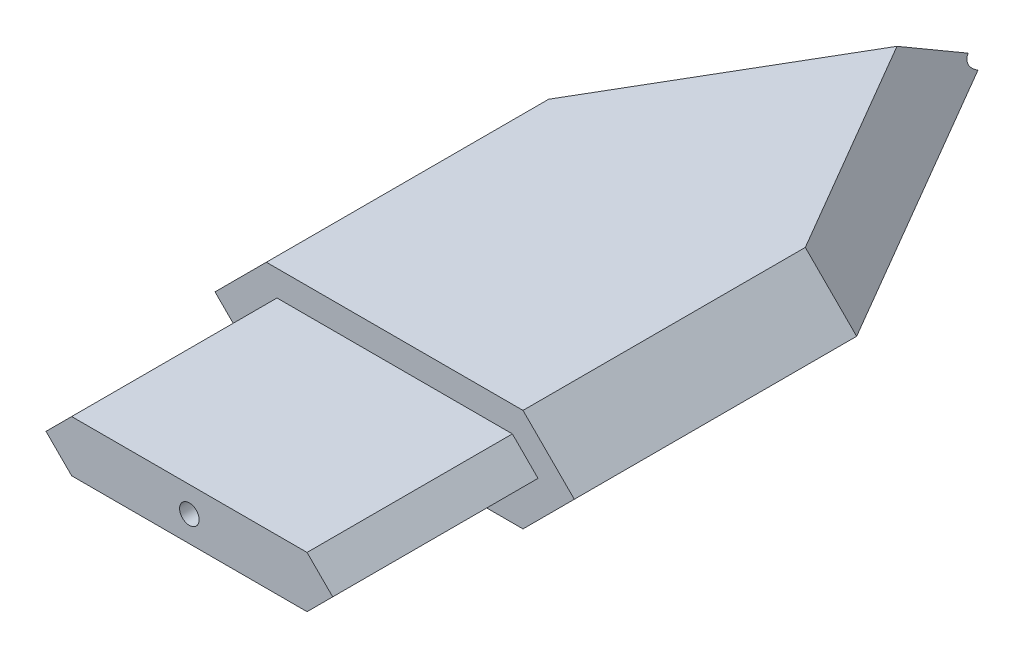
ISO-10303-21;
HEADER;
FILE_DESCRIPTION(('STEP AP214'),'2;1');
FILE_NAME('part.step','',(''),(''),'','','');
FILE_SCHEMA(('AUTOMOTIVE_DESIGN { 1 0 10303 214 1 1 1 1 }'));
ENDSEC;
DATA;
#1=APPLICATION_CONTEXT('core data for automotive mechanical design processes');
#2=APPLICATION_PROTOCOL_DEFINITION('international standard','automotive_design',2000,#1);
#3=PRODUCT_CONTEXT('',#1,'mechanical');
#4=PRODUCT('Part','Part','',(#3));
#5=PRODUCT_RELATED_PRODUCT_CATEGORY('part','',(#4));
#6=PRODUCT_DEFINITION_FORMATION('','',#4);
#7=PRODUCT_DEFINITION_CONTEXT('part definition',#1,'design');
#8=PRODUCT_DEFINITION('design','',#6,#7);
#9=PRODUCT_DEFINITION_SHAPE('','',#8);
#10=(LENGTH_UNIT() NAMED_UNIT(*) SI_UNIT(.MILLI.,.METRE.));
#11=(NAMED_UNIT(*) PLANE_ANGLE_UNIT() SI_UNIT($,.RADIAN.));
#12=(NAMED_UNIT(*) SI_UNIT($,.STERADIAN.) SOLID_ANGLE_UNIT());
#13=UNCERTAINTY_MEASURE_WITH_UNIT(LENGTH_MEASURE(1.E-05),#10,'distance_accuracy_value','');
#14=(GEOMETRIC_REPRESENTATION_CONTEXT(3) GLOBAL_UNCERTAINTY_ASSIGNED_CONTEXT((#13)) GLOBAL_UNIT_ASSIGNED_CONTEXT((#10,
#11,#12)) REPRESENTATION_CONTEXT('',''));
#15=CARTESIAN_POINT('',(0.,0.,0.));
#16=DIRECTION('',(0.,0.,1.));
#17=DIRECTION('',(1.,0.,0.));
#18=AXIS2_PLACEMENT_3D('',#15,#16,#17);
#19=CARTESIAN_POINT('',(17.5,-17.5,0.));
#20=DIRECTION('',(0.707106781186548,-0.707106781186547,0.));
#21=DIRECTION('',(-0.707106781186547,-0.707106781186548,0.));
#22=AXIS2_PLACEMENT_3D('',#19,#20,#21);
#23=PLANE('',#22);
#24=DIRECTION('',(0.,0.,-1.));
#25=VECTOR('',#24,1.);
#26=CARTESIAN_POINT('',(35.,0.,0.));
#27=LINE('',#26,#25);
#28=CARTESIAN_POINT('',(35.,0.,-575.));
#29=VERTEX_POINT('',#28);
#30=CARTESIAN_POINT('',(35.,0.,-630.));
#31=VERTEX_POINT('',#30);
#32=EDGE_CURVE('E124',#29,#31,#27,.T.);
#33=ORIENTED_EDGE('',*,*,#32,.F.);
#34=DIRECTION('',(-0.707106781186547,-0.707106781186548,0.));
#35=VECTOR('',#34,1.);
#36=CARTESIAN_POINT('',(17.5,-17.5,-575.));
#37=LINE('',#36,#35);
#38=CARTESIAN_POINT('',(25.,-10.,-575.));
#39=VERTEX_POINT('',#38);
#40=EDGE_CURVE('E291',#29,#39,#37,.T.);
#41=ORIENTED_EDGE('',*,*,#40,.T.);
#42=CARTESIAN_POINT('',(25.,-10.,-575.));
#43=DIRECTION('',(0.,0.,-1.));
#44=VECTOR('',#43,1.);
#45=LINE('',#42,#44);
#46=CARTESIAN_POINT('',(25.,-10.,-630.));
#47=VERTEX_POINT('',#46);
#48=EDGE_CURVE('E314',#39,#47,#45,.T.);
#49=ORIENTED_EDGE('',*,*,#48,.T.);
#50=DIRECTION('',(0.707106781186547,0.707106781186548,0.));
#51=VECTOR('',#50,1.);
#52=CARTESIAN_POINT('',(25.,-10.,-630.));
#53=LINE('',#52,#51);
#54=EDGE_CURVE('E459',#47,#31,#53,.T.);
#55=ORIENTED_EDGE('',*,*,#54,.T.);
#56=EDGE_LOOP('',(#33,#41,#49,#55));
#57=FACE_BOUND('',#56,.T.);
#58=ADVANCED_FACE('F113',(#57),#23,.T.);
#59=CARTESIAN_POINT('',(-17.5,-17.5,0.));
#60=DIRECTION('',(-0.707106781186548,-0.707106781186547,0.));
#61=DIRECTION('',(-0.707106781186547,0.707106781186548,0.));
#62=AXIS2_PLACEMENT_3D('',#59,#60,#61);
#63=PLANE('',#62);
#64=CARTESIAN_POINT('',(-25.,-10.,-630.));
#65=DIRECTION('',(0.,0.,1.));
#66=VECTOR('',#65,1.);
#67=LINE('',#64,#66);
#68=CARTESIAN_POINT('',(-25.,-10.,-630.));
#69=VERTEX_POINT('',#68);
#70=CARTESIAN_POINT('',(-25.,-10.,-575.));
#71=VERTEX_POINT('',#70);
#72=EDGE_CURVE('E319',#69,#71,#67,.T.);
#73=ORIENTED_EDGE('',*,*,#72,.T.);
#74=DIRECTION('',(-0.707106781186547,0.707106781186548,0.));
#75=VECTOR('',#74,1.);
#76=CARTESIAN_POINT('',(-17.5,-17.5,-575.));
#77=LINE('',#76,#75);
#78=CARTESIAN_POINT('',(-35.,0.,-575.));
#79=VERTEX_POINT('',#78);
#80=EDGE_CURVE('E286',#71,#79,#77,.T.);
#81=ORIENTED_EDGE('',*,*,#80,.T.);
#82=DIRECTION('',(0.,0.,1.));
#83=VECTOR('',#82,1.);
#84=CARTESIAN_POINT('',(-35.,0.,0.));
#85=LINE('',#84,#83);
#86=CARTESIAN_POINT('',(-35.,0.,-630.));
#87=VERTEX_POINT('',#86);
#88=EDGE_CURVE('E456',#87,#79,#85,.T.);
#89=ORIENTED_EDGE('',*,*,#88,.F.);
#90=DIRECTION('',(-0.707106781186547,0.707106781186548,0.));
#91=VECTOR('',#90,1.);
#92=CARTESIAN_POINT('',(-25.,-10.,-630.));
#93=LINE('',#92,#91);
#94=EDGE_CURVE('E324',#69,#87,#93,.T.);
#95=ORIENTED_EDGE('',*,*,#94,.F.);
#96=EDGE_LOOP('',(#73,#81,#89,#95));
#97=FACE_BOUND('',#96,.T.);
#98=ADVANCED_FACE('F326',(#97),#63,.T.);
#99=CARTESIAN_POINT('',(0.,-10.,0.));
#100=DIRECTION('',(0.,-1.,0.));
#101=DIRECTION('',(0.,0.,1.));
#102=AXIS2_PLACEMENT_3D('',#99,#100,#101);
#103=PLANE('',#102);
#104=ORIENTED_EDGE('',*,*,#48,.F.);
#105=DIRECTION('',(-1.,0.,0.));
#106=VECTOR('',#105,1.);
#107=CARTESIAN_POINT('',(0.,-10.,-575.));
#108=LINE('',#107,#106);
#109=EDGE_CURVE('E296',#39,#71,#108,.T.);
#110=ORIENTED_EDGE('',*,*,#109,.T.);
#111=ORIENTED_EDGE('',*,*,#72,.F.);
#112=CARTESIAN_POINT('',(0.,-9.99999999999993,-672.857142857143));
#113=DIRECTION('',(-0.503871025524086,0.,0.863778900898434));
#114=VECTOR('',#113,1.);
#115=LINE('',#112,#114);
#116=CARTESIAN_POINT('',(0.,-10.,-672.857142857143));
#117=VERTEX_POINT('',#116);
#118=EDGE_CURVE('E491',#117,#69,#115,.T.);
#119=ORIENTED_EDGE('',*,*,#118,.F.);
#120=CARTESIAN_POINT('',(25.,-10.,-630.));
#121=DIRECTION('',(-0.503871025524086,0.,-0.863778900898433));
#122=VECTOR('',#121,1.);
#123=LINE('',#120,#122);
#124=EDGE_CURVE('E489',#47,#117,#123,.T.);
#125=ORIENTED_EDGE('',*,*,#124,.F.);
#126=EDGE_LOOP('',(#104,#110,#111,#119,#125));
#127=FACE_BOUND('',#126,.T.);
#128=ADVANCED_FACE('F336',(#127),#103,.T.);
#129=CARTESIAN_POINT('',(-17.5,17.5,0.));
#130=DIRECTION('',(-0.707106781186548,0.707106781186547,0.));
#131=DIRECTION('',(-0.707106781186547,-0.707106781186548,0.));
#132=AXIS2_PLACEMENT_3D('',#129,#130,#131);
#133=PLANE('',#132);
#134=ORIENTED_EDGE('',*,*,#88,.T.);
#135=DIRECTION('',(0.707106781186547,0.707106781186548,0.));
#136=VECTOR('',#135,1.);
#137=CARTESIAN_POINT('',(-17.5,17.5,-575.));
#138=LINE('',#137,#136);
#139=CARTESIAN_POINT('',(-25.,10.,-575.));
#140=VERTEX_POINT('',#139);
#141=EDGE_CURVE('E281',#79,#140,#138,.T.);
#142=ORIENTED_EDGE('',*,*,#141,.T.);
#143=DIRECTION('',(0.,0.,1.));
#144=VECTOR('',#143,1.);
#145=CARTESIAN_POINT('',(-25.,10.,0.));
#146=LINE('',#145,#144);
#147=CARTESIAN_POINT('',(-25.,10.,-630.));
#148=VERTEX_POINT('',#147);
#149=EDGE_CURVE('E118',#148,#140,#146,.T.);
#150=ORIENTED_EDGE('',*,*,#149,.F.);
#151=DIRECTION('',(-0.707106781186547,-0.707106781186548,0.));
#152=VECTOR('',#151,1.);
#153=CARTESIAN_POINT('',(-25.,10.,-630.));
#154=LINE('',#153,#152);
#155=EDGE_CURVE('E415',#148,#87,#154,.T.);
#156=ORIENTED_EDGE('',*,*,#155,.T.);
#157=EDGE_LOOP('',(#134,#142,#150,#156));
#158=FACE_BOUND('',#157,.T.);
#159=ADVANCED_FACE('F115',(#158),#133,.T.);
#160=CARTESIAN_POINT('',(17.5,17.5,0.));
#161=DIRECTION('',(0.707106781186548,0.707106781186547,0.));
#162=DIRECTION('',(-0.707106781186547,0.707106781186548,0.));
#163=AXIS2_PLACEMENT_3D('',#160,#161,#162);
#164=PLANE('',#163);
#165=DIRECTION('',(0.,0.,-1.));
#166=VECTOR('',#165,1.);
#167=CARTESIAN_POINT('',(25.,10.,0.));
#168=LINE('',#167,#166);
#169=CARTESIAN_POINT('',(25.,10.,-575.));
#170=VERTEX_POINT('',#169);
#171=CARTESIAN_POINT('',(25.,10.,-630.));
#172=VERTEX_POINT('',#171);
#173=EDGE_CURVE('E381',#170,#172,#168,.T.);
#174=ORIENTED_EDGE('',*,*,#173,.F.);
#175=DIRECTION('',(0.707106781186547,-0.707106781186548,0.));
#176=VECTOR('',#175,1.);
#177=CARTESIAN_POINT('',(17.5,17.5,-575.));
#178=LINE('',#177,#176);
#179=EDGE_CURVE('E132',#170,#29,#178,.T.);
#180=ORIENTED_EDGE('',*,*,#179,.T.);
#181=ORIENTED_EDGE('',*,*,#32,.T.);
#182=DIRECTION('',(0.707106781186547,-0.707106781186548,0.));
#183=VECTOR('',#182,1.);
#184=CARTESIAN_POINT('',(25.,10.,-630.));
#185=LINE('',#184,#183);
#186=EDGE_CURVE('E407',#172,#31,#185,.T.);
#187=ORIENTED_EDGE('',*,*,#186,.F.);
#188=EDGE_LOOP('',(#174,#180,#181,#187));
#189=FACE_BOUND('',#188,.T.);
#190=ADVANCED_FACE('F344',(#189),#164,.T.);
#191=CARTESIAN_POINT('',(0.,10.,0.));
#192=DIRECTION('',(0.,1.,0.));
#193=DIRECTION('',(0.,0.,1.));
#194=AXIS2_PLACEMENT_3D('',#191,#192,#193);
#195=PLANE('',#194);
#196=ORIENTED_EDGE('',*,*,#149,.T.);
#197=DIRECTION('',(1.,0.,0.));
#198=VECTOR('',#197,1.);
#199=CARTESIAN_POINT('',(0.,10.,-575.));
#200=LINE('',#199,#198);
#201=EDGE_CURVE('E13',#140,#170,#200,.T.);
#202=ORIENTED_EDGE('',*,*,#201,.T.);
#203=ORIENTED_EDGE('',*,*,#173,.T.);
#204=DIRECTION('',(-0.503871025524086,0.,-0.863778900898434));
#205=VECTOR('',#204,1.);
#206=CARTESIAN_POINT('',(25.,10.,-630.));
#207=LINE('',#206,#205);
#208=CARTESIAN_POINT('',(0.,10.,-672.857142857143));
#209=VERTEX_POINT('',#208);
#210=EDGE_CURVE('E376',#172,#209,#207,.T.);
#211=ORIENTED_EDGE('',*,*,#210,.T.);
#212=DIRECTION('',(-0.503871025524086,0.,0.863778900898434));
#213=VECTOR('',#212,1.);
#214=CARTESIAN_POINT('',(-25.,10.,-630.));
#215=LINE('',#214,#213);
#216=EDGE_CURVE('E369',#209,#148,#215,.T.);
#217=ORIENTED_EDGE('',*,*,#216,.T.);
#218=EDGE_LOOP('',(#196,#202,#203,#211,#217));
#219=FACE_BOUND('',#218,.T.);
#220=ADVANCED_FACE('F339',(#219),#195,.T.);
#221=CARTESIAN_POINT('',(0.,-22.5001,-535.));
#222=DIRECTION('',(0.,0.,1.));
#223=DIRECTION('',(1.,0.,0.));
#224=AXIS2_PLACEMENT_3D('',#221,#222,#223);
#225=PLANE('',#224);
#226=CARTESIAN_POINT('',(0.,0.,-535.));
#227=DIRECTION('',(0.,0.,1.));
#228=DIRECTION('',(1.,0.,0.));
#229=AXIS2_PLACEMENT_3D('',#226,#227,#228);
#230=CIRCLE('',#229,1.9);
#231=CARTESIAN_POINT('',(1.9,0.,-535.));
#232=VERTEX_POINT('',#231);
#233=EDGE_CURVE('E301',#232,#232,#230,.T.);
#234=ORIENTED_EDGE('',*,*,#233,.F.);
#235=EDGE_LOOP('',(#234));
#236=FACE_BOUND('',#235,.T.);
#237=DIRECTION('',(-0.707106781186548,-0.707106781186547,0.));
#238=VECTOR('',#237,1.);
#239=CARTESIAN_POINT('',(-22.9289321881345,5.,-535.));
#240=LINE('',#239,#238);
#241=CARTESIAN_POINT('',(-22.9289321881345,5.,-535.));
#242=VERTEX_POINT('',#241);
#243=CARTESIAN_POINT('',(-27.9289321881345,0.,-535.));
#244=VERTEX_POINT('',#243);
#245=EDGE_CURVE('E249',#242,#244,#240,.T.);
#246=ORIENTED_EDGE('',*,*,#245,.T.);
#247=DIRECTION('',(0.707106781186548,-0.707106781186547,0.));
#248=VECTOR('',#247,1.);
#249=CARTESIAN_POINT('',(-27.9289321881345,0.,-535.));
#250=LINE('',#249,#248);
#251=CARTESIAN_POINT('',(-22.9289321881345,-5.,-535.));
#252=VERTEX_POINT('',#251);
#253=EDGE_CURVE('E263',#244,#252,#250,.T.);
#254=ORIENTED_EDGE('',*,*,#253,.T.);
#255=DIRECTION('',(1.,0.,0.));
#256=VECTOR('',#255,1.);
#257=CARTESIAN_POINT('',(-22.9289321881345,-5.,-535.));
#258=LINE('',#257,#256);
#259=CARTESIAN_POINT('',(22.9289321881345,-5.,-535.));
#260=VERTEX_POINT('',#259);
#261=EDGE_CURVE('E229',#252,#260,#258,.T.);
#262=ORIENTED_EDGE('',*,*,#261,.T.);
#263=DIRECTION('',(0.707106781186547,0.707106781186548,0.));
#264=VECTOR('',#263,1.);
#265=CARTESIAN_POINT('',(22.9289321881345,-5.,-535.));
#266=LINE('',#265,#264);
#267=CARTESIAN_POINT('',(27.9289321881345,0.,-535.));
#268=VERTEX_POINT('',#267);
#269=EDGE_CURVE('E139',#260,#268,#266,.T.);
#270=ORIENTED_EDGE('',*,*,#269,.T.);
#271=DIRECTION('',(-0.707106781186547,0.707106781186548,0.));
#272=VECTOR('',#271,1.);
#273=CARTESIAN_POINT('',(27.9289321881345,0.,-535.));
#274=LINE('',#273,#272);
#275=CARTESIAN_POINT('',(22.9289321881345,5.,-535.));
#276=VERTEX_POINT('',#275);
#277=EDGE_CURVE('E267',#268,#276,#274,.T.);
#278=ORIENTED_EDGE('',*,*,#277,.T.);
#279=DIRECTION('',(-1.,0.,0.));
#280=VECTOR('',#279,1.);
#281=CARTESIAN_POINT('',(22.9289321881345,5.,-535.));
#282=LINE('',#281,#280);
#283=EDGE_CURVE('E252',#276,#242,#282,.T.);
#284=ORIENTED_EDGE('',*,*,#283,.T.);
#285=EDGE_LOOP('',(#246,#254,#262,#270,#278,#284));
#286=FACE_BOUND('',#285,.T.);
#287=ADVANCED_FACE('F343',(#236,#286),#225,.T.);
#288=CARTESIAN_POINT('',(171.988130563798,171.988130563798,-100.326409495549));
#289=DIRECTION('',(0.653681652843412,0.653681652843412,-0.38131429749199));
#290=DIRECTION('',(-0.707106781186547,0.707106781186547,0.));
#291=AXIS2_PLACEMENT_3D('',#288,#289,#290);
#292=PLANE('',#291);
#293=CARTESIAN_POINT('',(0.,0.,-690.));
#294=DIRECTION('',(0.653681652843412,0.653681652843412,-0.38131429749199));
#295=DIRECTION('',(0.269629925519971,0.269629925519971,0.924445458925615));
#296=AXIS2_PLACEMENT_3D('',#293,#294,#295);
#297=ELLIPSE('',#296,4.9827662180433,1.9);
#298=CARTESIAN_POINT('',(0.,1.90000000000003,-686.742857142857));
#299=VERTEX_POINT('',#298);
#300=CARTESIAN_POINT('',(1.90000000000002,0.,-686.742857142857));
#301=VERTEX_POINT('',#300);
#302=EDGE_CURVE('E312',#299,#301,#297,.T.);
#303=ORIENTED_EDGE('',*,*,#302,.F.);
#304=DIRECTION('',(0.,-0.503871025524087,-0.863778900898433));
#305=VECTOR('',#304,1.);
#306=CARTESIAN_POINT('',(0.,10.,-672.857142857143));
#307=LINE('',#306,#305);
#308=EDGE_CURVE('E409',#209,#299,#307,.T.);
#309=ORIENTED_EDGE('',*,*,#308,.F.);
#310=ORIENTED_EDGE('',*,*,#210,.F.);
#311=ORIENTED_EDGE('',*,*,#186,.T.);
#312=DIRECTION('',(-0.503871025524086,0.,-0.863778900898434));
#313=VECTOR('',#312,1.);
#314=CARTESIAN_POINT('',(35.,0.,-630.));
#315=LINE('',#314,#313);
#316=EDGE_CURVE('E466',#31,#301,#315,.T.);
#317=ORIENTED_EDGE('',*,*,#316,.T.);
#318=EDGE_LOOP('',(#303,#309,#310,#311,#317));
#319=FACE_BOUND('',#318,.T.);
#320=ADVANCED_FACE('F346',(#319),#292,.T.);
#321=CARTESIAN_POINT('',(-171.988130563798,171.988130563798,-100.326409495549));
#322=DIRECTION('',(-0.653681652843412,0.653681652843412,-0.381314297491991));
#323=DIRECTION('',(-0.707106781186548,-0.707106781186548,0.));
#324=AXIS2_PLACEMENT_3D('',#321,#322,#323);
#325=PLANE('',#324);
#326=CARTESIAN_POINT('',(0.,0.,-690.));
#327=DIRECTION('',(-0.653681652843412,0.653681652843412,-0.381314297491991));
#328=DIRECTION('',(-0.269629925519971,0.269629925519971,0.924445458925614));
#329=AXIS2_PLACEMENT_3D('',#326,#327,#328);
#330=ELLIPSE('',#329,4.98276621804329,1.9);
#331=CARTESIAN_POINT('',(-1.90000000000002,0.,-686.742857142857));
#332=VERTEX_POINT('',#331);
#333=EDGE_CURVE('E310',#332,#299,#330,.T.);
#334=ORIENTED_EDGE('',*,*,#333,.F.);
#335=DIRECTION('',(-0.503871025524086,0.,0.863778900898434));
#336=VECTOR('',#335,1.);
#337=CARTESIAN_POINT('',(-35.,0.,-630.));
#338=LINE('',#337,#336);
#339=EDGE_CURVE('E468',#332,#87,#338,.T.);
#340=ORIENTED_EDGE('',*,*,#339,.T.);
#341=ORIENTED_EDGE('',*,*,#155,.F.);
#342=ORIENTED_EDGE('',*,*,#216,.F.);
#343=ORIENTED_EDGE('',*,*,#308,.T.);
#344=EDGE_LOOP('',(#334,#340,#341,#342,#343));
#345=FACE_BOUND('',#344,.T.);
#346=ADVANCED_FACE('F434',(#345),#325,.T.);
#347=CARTESIAN_POINT('',(171.988130563798,-171.988130563798,-100.326409495549));
#348=DIRECTION('',(0.653681652843412,-0.653681652843412,-0.38131429749199));
#349=DIRECTION('',(-0.707106781186547,-0.707106781186547,0.));
#350=AXIS2_PLACEMENT_3D('',#347,#348,#349);
#351=PLANE('',#350);
#352=CARTESIAN_POINT('',(0.,0.,-690.));
#353=DIRECTION('',(0.653681652843412,-0.653681652843412,-0.38131429749199));
#354=DIRECTION('',(0.269629925519971,-0.269629925519971,0.924445458925615));
#355=AXIS2_PLACEMENT_3D('',#352,#353,#354);
#356=ELLIPSE('',#355,4.9827662180433,1.9);
#357=CARTESIAN_POINT('',(0.,-1.90000000000003,-686.742857142857));
#358=VERTEX_POINT('',#357);
#359=EDGE_CURVE('E308',#301,#358,#356,.T.);
#360=ORIENTED_EDGE('',*,*,#359,.F.);
#361=ORIENTED_EDGE('',*,*,#316,.F.);
#362=ORIENTED_EDGE('',*,*,#54,.F.);
#363=ORIENTED_EDGE('',*,*,#124,.T.);
#364=DIRECTION('',(0.,0.503871025524087,-0.863778900898433));
#365=VECTOR('',#364,1.);
#366=CARTESIAN_POINT('',(0.,-10.,-672.857142857143));
#367=LINE('',#366,#365);
#368=EDGE_CURVE('E393',#117,#358,#367,.T.);
#369=ORIENTED_EDGE('',*,*,#368,.T.);
#370=EDGE_LOOP('',(#360,#361,#362,#363,#369));
#371=FACE_BOUND('',#370,.T.);
#372=ADVANCED_FACE('F437',(#371),#351,.T.);
#373=CARTESIAN_POINT('',(-171.988130563798,-171.988130563798,-100.326409495549));
#374=DIRECTION('',(-0.653681652843412,-0.653681652843412,-0.381314297491991));
#375=DIRECTION('',(-0.707106781186548,0.707106781186548,0.));
#376=AXIS2_PLACEMENT_3D('',#373,#374,#375);
#377=PLANE('',#376);
#378=CARTESIAN_POINT('',(0.,0.,-690.));
#379=DIRECTION('',(-0.653681652843412,-0.653681652843412,-0.381314297491991));
#380=DIRECTION('',(-0.269629925519971,-0.269629925519971,0.924445458925614));
#381=AXIS2_PLACEMENT_3D('',#378,#379,#380);
#382=ELLIPSE('',#381,4.98276621804329,1.9);
#383=EDGE_CURVE('E306',#358,#332,#382,.T.);
#384=ORIENTED_EDGE('',*,*,#383,.F.);
#385=ORIENTED_EDGE('',*,*,#368,.F.);
#386=ORIENTED_EDGE('',*,*,#118,.T.);
#387=ORIENTED_EDGE('',*,*,#94,.T.);
#388=ORIENTED_EDGE('',*,*,#339,.F.);
#389=EDGE_LOOP('',(#384,#385,#386,#387,#388));
#390=FACE_BOUND('',#389,.T.);
#391=ADVANCED_FACE('F496',(#390),#377,.T.);
#392=CARTESIAN_POINT('',(0.,0.,-690.0001));
#393=DIRECTION('',(0.,0.,1.));
#394=DIRECTION('',(1.,0.,0.));
#395=AXIS2_PLACEMENT_3D('',#392,#393,#394);
#396=CYLINDRICAL_SURFACE('',#395,1.9);
#397=ORIENTED_EDGE('',*,*,#302,.T.);
#398=ORIENTED_EDGE('',*,*,#359,.T.);
#399=ORIENTED_EDGE('',*,*,#383,.T.);
#400=ORIENTED_EDGE('',*,*,#333,.T.);
#401=EDGE_LOOP('',(#397,#398,#399,#400));
#402=FACE_BOUND('',#401,.T.);
#403=ORIENTED_EDGE('',*,*,#233,.T.);
#404=EDGE_LOOP('',(#403));
#405=FACE_BOUND('',#404,.T.);
#406=ADVANCED_FACE('F513',(#402,#405),#396,.F.);
#407=CARTESIAN_POINT('',(0.,-6.25,-575.));
#408=DIRECTION('',(0.,0.,1.));
#409=DIRECTION('',(1.,0.,0.));
#410=AXIS2_PLACEMENT_3D('',#407,#408,#409);
#411=PLANE('',#410);
#412=ORIENTED_EDGE('',*,*,#40,.F.);
#413=ORIENTED_EDGE('',*,*,#179,.F.);
#414=ORIENTED_EDGE('',*,*,#201,.F.);
#415=ORIENTED_EDGE('',*,*,#141,.F.);
#416=ORIENTED_EDGE('',*,*,#80,.F.);
#417=ORIENTED_EDGE('',*,*,#109,.F.);
#418=EDGE_LOOP('',(#412,#413,#414,#415,#416,#417));
#419=FACE_BOUND('',#418,.T.);
#420=DIRECTION('',(-0.707106781186548,-0.707106781186547,0.));
#421=VECTOR('',#420,1.);
#422=CARTESIAN_POINT('',(-22.9289321881345,5.,-575.));
#423=LINE('',#422,#421);
#424=CARTESIAN_POINT('',(-22.9289321881345,5.,-575.));
#425=VERTEX_POINT('',#424);
#426=CARTESIAN_POINT('',(-27.9289321881345,0.,-575.));
#427=VERTEX_POINT('',#426);
#428=EDGE_CURVE('E235',#425,#427,#423,.T.);
#429=ORIENTED_EDGE('',*,*,#428,.F.);
#430=DIRECTION('',(-1.,0.,0.));
#431=VECTOR('',#430,1.);
#432=CARTESIAN_POINT('',(22.9289321881345,5.,-575.));
#433=LINE('',#432,#431);
#434=CARTESIAN_POINT('',(22.9289321881345,5.,-575.));
#435=VERTEX_POINT('',#434);
#436=EDGE_CURVE('E259',#435,#425,#433,.T.);
#437=ORIENTED_EDGE('',*,*,#436,.F.);
#438=DIRECTION('',(-0.707106781186547,0.707106781186548,0.));
#439=VECTOR('',#438,1.);
#440=CARTESIAN_POINT('',(27.9289321881345,0.,-575.));
#441=LINE('',#440,#439);
#442=CARTESIAN_POINT('',(27.9289321881345,0.,-575.));
#443=VERTEX_POINT('',#442);
#444=EDGE_CURVE('E256',#443,#435,#441,.T.);
#445=ORIENTED_EDGE('',*,*,#444,.F.);
#446=DIRECTION('',(0.707106781186547,0.707106781186548,0.));
#447=VECTOR('',#446,1.);
#448=CARTESIAN_POINT('',(22.9289321881345,-5.,-575.));
#449=LINE('',#448,#447);
#450=CARTESIAN_POINT('',(22.9289321881345,-5.,-575.));
#451=VERTEX_POINT('',#450);
#452=EDGE_CURVE('E245',#451,#443,#449,.T.);
#453=ORIENTED_EDGE('',*,*,#452,.F.);
#454=DIRECTION('',(1.,0.,0.));
#455=VECTOR('',#454,1.);
#456=CARTESIAN_POINT('',(-22.9289321881345,-5.,-575.));
#457=LINE('',#456,#455);
#458=CARTESIAN_POINT('',(-22.9289321881345,-5.,-575.));
#459=VERTEX_POINT('',#458);
#460=EDGE_CURVE('E227',#459,#451,#457,.T.);
#461=ORIENTED_EDGE('',*,*,#460,.F.);
#462=DIRECTION('',(0.707106781186548,-0.707106781186547,0.));
#463=VECTOR('',#462,1.);
#464=CARTESIAN_POINT('',(-27.9289321881345,0.,-575.));
#465=LINE('',#464,#463);
#466=EDGE_CURVE('E241',#427,#459,#465,.T.);
#467=ORIENTED_EDGE('',*,*,#466,.F.);
#468=EDGE_LOOP('',(#429,#437,#445,#453,#461,#467));
#469=FACE_BOUND('',#468,.T.);
#470=ADVANCED_FACE('F240',(#419,#469),#411,.T.);
#471=CARTESIAN_POINT('',(-27.9289321881345,0.,-575.));
#472=DIRECTION('',(-0.707106781186547,-0.707106781186548,0.));
#473=DIRECTION('',(0.707106781186548,-0.707106781186547,0.));
#474=AXIS2_PLACEMENT_3D('',#471,#472,#473);
#475=PLANE('',#474);
#476=ORIENTED_EDGE('',*,*,#253,.F.);
#477=DIRECTION('',(0.,0.,1.));
#478=VECTOR('',#477,1.);
#479=CARTESIAN_POINT('',(-27.9289321881345,0.,-575.));
#480=LINE('',#479,#478);
#481=EDGE_CURVE('E248',#427,#244,#480,.T.);
#482=ORIENTED_EDGE('',*,*,#481,.F.);
#483=ORIENTED_EDGE('',*,*,#466,.T.);
#484=DIRECTION('',(0.,0.,1.));
#485=VECTOR('',#484,1.);
#486=CARTESIAN_POINT('',(-22.9289321881345,-5.,-575.));
#487=LINE('',#486,#485);
#488=EDGE_CURVE('E224',#459,#252,#487,.T.);
#489=ORIENTED_EDGE('',*,*,#488,.T.);
#490=EDGE_LOOP('',(#476,#482,#483,#489));
#491=FACE_BOUND('',#490,.T.);
#492=ADVANCED_FACE('F247',(#491),#475,.T.);
#493=CARTESIAN_POINT('',(-22.9289321881345,5.,-575.));
#494=DIRECTION('',(-0.707106781186547,0.707106781186548,0.));
#495=DIRECTION('',(-0.707106781186548,-0.707106781186547,0.));
#496=AXIS2_PLACEMENT_3D('',#493,#494,#495);
#497=PLANE('',#496);
#498=ORIENTED_EDGE('',*,*,#245,.F.);
#499=DIRECTION('',(0.,0.,1.));
#500=VECTOR('',#499,1.);
#501=CARTESIAN_POINT('',(-22.9289321881345,5.,-575.));
#502=LINE('',#501,#500);
#503=EDGE_CURVE('E273',#425,#242,#502,.T.);
#504=ORIENTED_EDGE('',*,*,#503,.F.);
#505=ORIENTED_EDGE('',*,*,#428,.T.);
#506=ORIENTED_EDGE('',*,*,#481,.T.);
#507=EDGE_LOOP('',(#498,#504,#505,#506));
#508=FACE_BOUND('',#507,.T.);
#509=ADVANCED_FACE('F591',(#508),#497,.T.);
#510=CARTESIAN_POINT('',(22.9289321881345,5.,-575.));
#511=DIRECTION('',(0.,1.,0.));
#512=DIRECTION('',(-1.,0.,0.));
#513=AXIS2_PLACEMENT_3D('',#510,#511,#512);
#514=PLANE('',#513);
#515=ORIENTED_EDGE('',*,*,#283,.F.);
#516=DIRECTION('',(0.,0.,1.));
#517=VECTOR('',#516,1.);
#518=CARTESIAN_POINT('',(22.9289321881345,5.,-575.));
#519=LINE('',#518,#517);
#520=EDGE_CURVE('E275',#435,#276,#519,.T.);
#521=ORIENTED_EDGE('',*,*,#520,.F.);
#522=ORIENTED_EDGE('',*,*,#436,.T.);
#523=ORIENTED_EDGE('',*,*,#503,.T.);
#524=EDGE_LOOP('',(#515,#521,#522,#523));
#525=FACE_BOUND('',#524,.T.);
#526=ADVANCED_FACE('F600',(#525),#514,.T.);
#527=CARTESIAN_POINT('',(27.9289321881345,0.,-575.));
#528=DIRECTION('',(0.707106781186548,0.707106781186547,0.));
#529=DIRECTION('',(-0.707106781186547,0.707106781186548,0.));
#530=AXIS2_PLACEMENT_3D('',#527,#528,#529);
#531=PLANE('',#530);
#532=ORIENTED_EDGE('',*,*,#277,.F.);
#533=DIRECTION('',(0.,0.,1.));
#534=VECTOR('',#533,1.);
#535=CARTESIAN_POINT('',(27.9289321881345,0.,-575.));
#536=LINE('',#535,#534);
#537=EDGE_CURVE('E277',#443,#268,#536,.T.);
#538=ORIENTED_EDGE('',*,*,#537,.F.);
#539=ORIENTED_EDGE('',*,*,#444,.T.);
#540=ORIENTED_EDGE('',*,*,#520,.T.);
#541=EDGE_LOOP('',(#532,#538,#539,#540));
#542=FACE_BOUND('',#541,.T.);
#543=ADVANCED_FACE('F597',(#542),#531,.T.);
#544=CARTESIAN_POINT('',(22.9289321881345,-5.,-575.));
#545=DIRECTION('',(0.707106781186548,-0.707106781186547,0.));
#546=DIRECTION('',(0.707106781186547,0.707106781186548,0.));
#547=AXIS2_PLACEMENT_3D('',#544,#545,#546);
#548=PLANE('',#547);
#549=ORIENTED_EDGE('',*,*,#269,.F.);
#550=DIRECTION('',(0.,0.,1.));
#551=VECTOR('',#550,1.);
#552=CARTESIAN_POINT('',(22.9289321881345,-5.,-575.));
#553=LINE('',#552,#551);
#554=EDGE_CURVE('E234',#451,#260,#553,.T.);
#555=ORIENTED_EDGE('',*,*,#554,.F.);
#556=ORIENTED_EDGE('',*,*,#452,.T.);
#557=ORIENTED_EDGE('',*,*,#537,.T.);
#558=EDGE_LOOP('',(#549,#555,#556,#557));
#559=FACE_BOUND('',#558,.T.);
#560=ADVANCED_FACE('F594',(#559),#548,.T.);
#561=CARTESIAN_POINT('',(-22.9289321881345,-5.,-575.));
#562=DIRECTION('',(0.,-1.,0.));
#563=DIRECTION('',(1.,0.,0.));
#564=AXIS2_PLACEMENT_3D('',#561,#562,#563);
#565=PLANE('',#564);
#566=ORIENTED_EDGE('',*,*,#261,.F.);
#567=ORIENTED_EDGE('',*,*,#488,.F.);
#568=ORIENTED_EDGE('',*,*,#460,.T.);
#569=ORIENTED_EDGE('',*,*,#554,.T.);
#570=EDGE_LOOP('',(#566,#567,#568,#569));
#571=FACE_BOUND('',#570,.T.);
#572=ADVANCED_FACE('F226',(#571),#565,.T.);
#573=CLOSED_SHELL('',(#58,#98,#128,#159,#190,#220,#287,#320,#346,#372,#391,#406,#470,#492,#509,
#526,#543,#560,#572));
#574=MANIFOLD_SOLID_BREP('B2',#573);
#575=ADVANCED_BREP_SHAPE_REPRESENTATION('',(#18,#574),#14);
#576=SHAPE_DEFINITION_REPRESENTATION(#9,#575);
ENDSEC;
END-ISO-10303-21;
